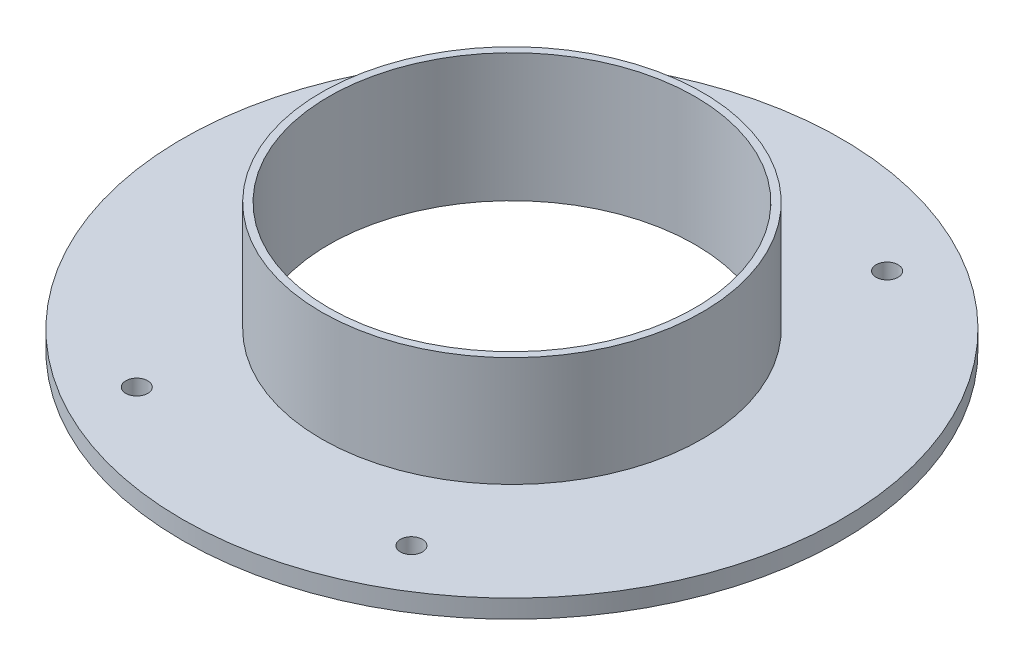
ISO-10303-21;
HEADER;
FILE_DESCRIPTION(('STEP AP214'),'2;1');
FILE_NAME('part.step','',(''),(''),'','','');
FILE_SCHEMA(('AUTOMOTIVE_DESIGN { 1 0 10303 214 1 1 1 1 }'));
ENDSEC;
DATA;
#1=APPLICATION_CONTEXT('core data for automotive mechanical design processes');
#2=APPLICATION_PROTOCOL_DEFINITION('international standard','automotive_design',2000,#1);
#3=PRODUCT_CONTEXT('',#1,'mechanical');
#4=PRODUCT('Part','Part','',(#3));
#5=PRODUCT_RELATED_PRODUCT_CATEGORY('part','',(#4));
#6=PRODUCT_DEFINITION_FORMATION('','',#4);
#7=PRODUCT_DEFINITION_CONTEXT('part definition',#1,'design');
#8=PRODUCT_DEFINITION('design','',#6,#7);
#9=PRODUCT_DEFINITION_SHAPE('','',#8);
#10=(LENGTH_UNIT() NAMED_UNIT(*) SI_UNIT(.MILLI.,.METRE.));
#11=(NAMED_UNIT(*) PLANE_ANGLE_UNIT() SI_UNIT($,.RADIAN.));
#12=(NAMED_UNIT(*) SI_UNIT($,.STERADIAN.) SOLID_ANGLE_UNIT());
#13=UNCERTAINTY_MEASURE_WITH_UNIT(LENGTH_MEASURE(1.E-05),#10,'distance_accuracy_value','');
#14=(GEOMETRIC_REPRESENTATION_CONTEXT(3) GLOBAL_UNCERTAINTY_ASSIGNED_CONTEXT((#13)) GLOBAL_UNIT_ASSIGNED_CONTEXT((#10,
#11,#12)) REPRESENTATION_CONTEXT('',''));
#15=CARTESIAN_POINT('',(0.,0.,0.));
#16=DIRECTION('',(0.,0.,1.));
#17=DIRECTION('',(1.,0.,0.));
#18=AXIS2_PLACEMENT_3D('',#15,#16,#17);
#19=CARTESIAN_POINT('',(0.,5.,0.));
#20=DIRECTION('',(0.,1.,0.));
#21=DIRECTION('',(0.,0.,1.));
#22=AXIS2_PLACEMENT_3D('',#19,#20,#21);
#23=PLANE('',#22);
#24=CARTESIAN_POINT('',(-37.5000000000003,5.,64.9519052838327));
#25=DIRECTION('',(0.,1.,0.));
#26=DIRECTION('',(0.,0.,1.));
#27=AXIS2_PLACEMENT_3D('',#24,#25,#26);
#28=CIRCLE('',#27,2.99999999999999);
#29=CARTESIAN_POINT('',(-37.5000000000003,5.,67.9519052838327));
#30=VERTEX_POINT('',#29);
#31=EDGE_CURVE('E76',#30,#30,#28,.T.);
#32=ORIENTED_EDGE('',*,*,#31,.F.);
#33=EDGE_LOOP('',(#32));
#34=FACE_BOUND('',#33,.T.);
#35=CARTESIAN_POINT('',(-37.5000000000003,5.,-64.9519052838327));
#36=DIRECTION('',(0.,1.,0.));
#37=DIRECTION('',(0.,0.,-1.));
#38=AXIS2_PLACEMENT_3D('',#35,#36,#37);
#39=CIRCLE('',#38,2.99999999999999);
#40=CARTESIAN_POINT('',(-37.5000000000003,5.,-67.9519052838327));
#41=VERTEX_POINT('',#40);
#42=EDGE_CURVE('E60',#41,#41,#39,.T.);
#43=ORIENTED_EDGE('',*,*,#42,.F.);
#44=EDGE_LOOP('',(#43));
#45=FACE_BOUND('',#44,.T.);
#46=CARTESIAN_POINT('',(0.,5.,0.));
#47=DIRECTION('',(0.,1.,0.));
#48=DIRECTION('',(0.,0.,1.));
#49=AXIS2_PLACEMENT_3D('',#46,#47,#48);
#50=CIRCLE('',#49,90.);
#51=CARTESIAN_POINT('',(0.,5.,90.));
#52=VERTEX_POINT('',#51);
#53=EDGE_CURVE('E10',#52,#52,#50,.T.);
#54=ORIENTED_EDGE('',*,*,#53,.T.);
#55=EDGE_LOOP('',(#54));
#56=FACE_BOUND('',#55,.T.);
#57=CARTESIAN_POINT('',(37.5000000000003,5.,-64.9519052838327));
#58=DIRECTION('',(0.,1.,0.));
#59=DIRECTION('',(0.,0.,1.));
#60=AXIS2_PLACEMENT_3D('',#57,#58,#59);
#61=CIRCLE('',#60,2.99999999999999);
#62=CARTESIAN_POINT('',(37.5000000000003,5.,-61.9519052838327));
#63=VERTEX_POINT('',#62);
#64=EDGE_CURVE('E55',#63,#63,#61,.T.);
#65=ORIENTED_EDGE('',*,*,#64,.F.);
#66=EDGE_LOOP('',(#65));
#67=FACE_BOUND('',#66,.T.);
#68=CARTESIAN_POINT('',(37.5000000000003,5.,64.9519052838327));
#69=DIRECTION('',(0.,1.,0.));
#70=DIRECTION('',(0.,0.,-1.));
#71=AXIS2_PLACEMENT_3D('',#68,#69,#70);
#72=CIRCLE('',#71,2.99999999999999);
#73=CARTESIAN_POINT('',(37.5000000000003,5.,61.9519052838327));
#74=VERTEX_POINT('',#73);
#75=EDGE_CURVE('E68',#74,#74,#72,.T.);
#76=ORIENTED_EDGE('',*,*,#75,.F.);
#77=EDGE_LOOP('',(#76));
#78=FACE_BOUND('',#77,.T.);
#79=CARTESIAN_POINT('',(0.,5.,0.));
#80=DIRECTION('',(0.,1.,0.));
#81=DIRECTION('',(0.,0.,1.));
#82=AXIS2_PLACEMENT_3D('',#79,#80,#81);
#83=CIRCLE('',#82,52.);
#84=CARTESIAN_POINT('',(0.,5.,52.));
#85=VERTEX_POINT('',#84);
#86=EDGE_CURVE('E88',#85,#85,#83,.T.);
#87=ORIENTED_EDGE('',*,*,#86,.F.);
#88=EDGE_LOOP('',(#87));
#89=FACE_BOUND('',#88,.T.);
#90=ADVANCED_FACE('F37',(#34,#45,#56,#67,#78,#89),#23,.T.);
#91=CARTESIAN_POINT('',(0.,0.,0.));
#92=DIRECTION('',(0.,1.,0.));
#93=DIRECTION('',(0.,0.,1.));
#94=AXIS2_PLACEMENT_3D('',#91,#92,#93);
#95=PLANE('',#94);
#96=CARTESIAN_POINT('',(0.,0.,0.));
#97=DIRECTION('',(0.,1.,0.));
#98=DIRECTION('',(0.,0.,1.));
#99=AXIS2_PLACEMENT_3D('',#96,#97,#98);
#100=CIRCLE('',#99,90.);
#101=CARTESIAN_POINT('',(0.,0.,90.));
#102=VERTEX_POINT('',#101);
#103=EDGE_CURVE('E41',#102,#102,#100,.T.);
#104=ORIENTED_EDGE('',*,*,#103,.F.);
#105=EDGE_LOOP('',(#104));
#106=FACE_BOUND('',#105,.T.);
#107=CARTESIAN_POINT('',(0.,0.,0.));
#108=DIRECTION('',(0.,1.,0.));
#109=DIRECTION('',(0.,0.,1.));
#110=AXIS2_PLACEMENT_3D('',#107,#108,#109);
#111=CIRCLE('',#110,50.);
#112=CARTESIAN_POINT('',(0.,0.,50.));
#113=VERTEX_POINT('',#112);
#114=EDGE_CURVE('E50',#113,#113,#111,.T.);
#115=ORIENTED_EDGE('',*,*,#114,.T.);
#116=EDGE_LOOP('',(#115));
#117=FACE_BOUND('',#116,.T.);
#118=CARTESIAN_POINT('',(37.5000000000003,0.,-64.9519052838327));
#119=DIRECTION('',(0.,1.,0.));
#120=DIRECTION('',(0.,0.,1.));
#121=AXIS2_PLACEMENT_3D('',#118,#119,#120);
#122=CIRCLE('',#121,2.99999999999999);
#123=CARTESIAN_POINT('',(37.5000000000003,0.,-61.9519052838327));
#124=VERTEX_POINT('',#123);
#125=EDGE_CURVE('E56',#124,#124,#122,.T.);
#126=ORIENTED_EDGE('',*,*,#125,.T.);
#127=EDGE_LOOP('',(#126));
#128=FACE_BOUND('',#127,.T.);
#129=CARTESIAN_POINT('',(-37.5000000000003,0.,-64.9519052838327));
#130=DIRECTION('',(0.,1.,0.));
#131=DIRECTION('',(0.,0.,-1.));
#132=AXIS2_PLACEMENT_3D('',#129,#130,#131);
#133=CIRCLE('',#132,2.99999999999999);
#134=CARTESIAN_POINT('',(-37.5000000000003,0.,-67.9519052838327));
#135=VERTEX_POINT('',#134);
#136=EDGE_CURVE('E64',#135,#135,#133,.T.);
#137=ORIENTED_EDGE('',*,*,#136,.T.);
#138=EDGE_LOOP('',(#137));
#139=FACE_BOUND('',#138,.T.);
#140=CARTESIAN_POINT('',(37.5000000000003,0.,64.9519052838327));
#141=DIRECTION('',(0.,1.,0.));
#142=DIRECTION('',(0.,0.,-1.));
#143=AXIS2_PLACEMENT_3D('',#140,#141,#142);
#144=CIRCLE('',#143,2.99999999999999);
#145=CARTESIAN_POINT('',(37.5000000000003,0.,61.9519052838327));
#146=VERTEX_POINT('',#145);
#147=EDGE_CURVE('E72',#146,#146,#144,.T.);
#148=ORIENTED_EDGE('',*,*,#147,.T.);
#149=EDGE_LOOP('',(#148));
#150=FACE_BOUND('',#149,.T.);
#151=CARTESIAN_POINT('',(-37.5000000000003,0.,64.9519052838327));
#152=DIRECTION('',(0.,1.,0.));
#153=DIRECTION('',(0.,0.,1.));
#154=AXIS2_PLACEMENT_3D('',#151,#152,#153);
#155=CIRCLE('',#154,2.99999999999999);
#156=CARTESIAN_POINT('',(-37.5000000000003,0.,67.9519052838327));
#157=VERTEX_POINT('',#156);
#158=EDGE_CURVE('E80',#157,#157,#155,.T.);
#159=ORIENTED_EDGE('',*,*,#158,.T.);
#160=EDGE_LOOP('',(#159));
#161=FACE_BOUND('',#160,.T.);
#162=ADVANCED_FACE('F118',(#106,#117,#128,#139,#150,#161),#95,.F.);
#163=CARTESIAN_POINT('',(0.,5.,0.));
#164=DIRECTION('',(0.,-1.,0.));
#165=DIRECTION('',(0.,0.,-1.));
#166=AXIS2_PLACEMENT_3D('',#163,#164,#165);
#167=CYLINDRICAL_SURFACE('',#166,90.);
#168=ORIENTED_EDGE('',*,*,#53,.F.);
#169=EDGE_LOOP('',(#168));
#170=FACE_BOUND('',#169,.T.);
#171=ORIENTED_EDGE('',*,*,#103,.T.);
#172=EDGE_LOOP('',(#171));
#173=FACE_BOUND('',#172,.T.);
#174=ADVANCED_FACE('F39',(#170,#173),#167,.T.);
#175=CARTESIAN_POINT('',(0.,5.,0.));
#176=DIRECTION('',(0.,-1.,0.));
#177=DIRECTION('',(0.,0.,-1.));
#178=AXIS2_PLACEMENT_3D('',#175,#176,#177);
#179=CYLINDRICAL_SURFACE('',#178,50.);
#180=ORIENTED_EDGE('',*,*,#114,.F.);
#181=EDGE_LOOP('',(#180));
#182=FACE_BOUND('',#181,.T.);
#183=CARTESIAN_POINT('',(0.,35.,0.));
#184=DIRECTION('',(0.,1.,0.));
#185=DIRECTION('',(0.,0.,1.));
#186=AXIS2_PLACEMENT_3D('',#183,#184,#185);
#187=CIRCLE('',#186,50.);
#188=CARTESIAN_POINT('',(0.,35.,50.));
#189=VERTEX_POINT('',#188);
#190=EDGE_CURVE('E92',#189,#189,#187,.T.);
#191=ORIENTED_EDGE('',*,*,#190,.T.);
#192=EDGE_LOOP('',(#191));
#193=FACE_BOUND('',#192,.T.);
#194=ADVANCED_FACE('F100',(#182,#193),#179,.F.);
#195=CARTESIAN_POINT('',(37.5000000000003,5.,-64.9519052838327));
#196=DIRECTION('',(0.,-1.,0.));
#197=DIRECTION('',(0.,0.,-1.));
#198=AXIS2_PLACEMENT_3D('',#195,#196,#197);
#199=CYLINDRICAL_SURFACE('',#198,2.99999999999999);
#200=ORIENTED_EDGE('',*,*,#64,.T.);
#201=EDGE_LOOP('',(#200));
#202=FACE_BOUND('',#201,.T.);
#203=ORIENTED_EDGE('',*,*,#125,.F.);
#204=EDGE_LOOP('',(#203));
#205=FACE_BOUND('',#204,.T.);
#206=ADVANCED_FACE('F130',(#202,#205),#199,.F.);
#207=CARTESIAN_POINT('',(-37.5000000000003,5.,-64.9519052838327));
#208=DIRECTION('',(0.,-1.,0.));
#209=DIRECTION('',(0.,0.,-1.));
#210=AXIS2_PLACEMENT_3D('',#207,#208,#209);
#211=CYLINDRICAL_SURFACE('',#210,2.99999999999999);
#212=ORIENTED_EDGE('',*,*,#42,.T.);
#213=EDGE_LOOP('',(#212));
#214=FACE_BOUND('',#213,.T.);
#215=ORIENTED_EDGE('',*,*,#136,.F.);
#216=EDGE_LOOP('',(#215));
#217=FACE_BOUND('',#216,.T.);
#218=ADVANCED_FACE('F134',(#214,#217),#211,.F.);
#219=CARTESIAN_POINT('',(37.5000000000003,5.,64.9519052838327));
#220=DIRECTION('',(0.,-1.,0.));
#221=DIRECTION('',(0.,0.,-1.));
#222=AXIS2_PLACEMENT_3D('',#219,#220,#221);
#223=CYLINDRICAL_SURFACE('',#222,2.99999999999999);
#224=ORIENTED_EDGE('',*,*,#75,.T.);
#225=EDGE_LOOP('',(#224));
#226=FACE_BOUND('',#225,.T.);
#227=ORIENTED_EDGE('',*,*,#147,.F.);
#228=EDGE_LOOP('',(#227));
#229=FACE_BOUND('',#228,.T.);
#230=ADVANCED_FACE('F114',(#226,#229),#223,.F.);
#231=CARTESIAN_POINT('',(-37.5000000000003,5.,64.9519052838327));
#232=DIRECTION('',(0.,-1.,0.));
#233=DIRECTION('',(0.,0.,-1.));
#234=AXIS2_PLACEMENT_3D('',#231,#232,#233);
#235=CYLINDRICAL_SURFACE('',#234,2.99999999999999);
#236=ORIENTED_EDGE('',*,*,#31,.T.);
#237=EDGE_LOOP('',(#236));
#238=FACE_BOUND('',#237,.T.);
#239=ORIENTED_EDGE('',*,*,#158,.F.);
#240=EDGE_LOOP('',(#239));
#241=FACE_BOUND('',#240,.T.);
#242=ADVANCED_FACE('F105',(#238,#241),#235,.F.);
#243=CARTESIAN_POINT('',(0.,35.,0.));
#244=DIRECTION('',(0.,1.,0.));
#245=DIRECTION('',(0.,0.,1.));
#246=AXIS2_PLACEMENT_3D('',#243,#244,#245);
#247=PLANE('',#246);
#248=CARTESIAN_POINT('',(0.,35.,0.));
#249=DIRECTION('',(0.,1.,0.));
#250=DIRECTION('',(0.,0.,1.));
#251=AXIS2_PLACEMENT_3D('',#248,#249,#250);
#252=CIRCLE('',#251,52.);
#253=CARTESIAN_POINT('',(0.,35.,52.));
#254=VERTEX_POINT('',#253);
#255=EDGE_CURVE('E84',#254,#254,#252,.T.);
#256=ORIENTED_EDGE('',*,*,#255,.T.);
#257=EDGE_LOOP('',(#256));
#258=FACE_BOUND('',#257,.T.);
#259=ORIENTED_EDGE('',*,*,#190,.F.);
#260=EDGE_LOOP('',(#259));
#261=FACE_BOUND('',#260,.T.);
#262=ADVANCED_FACE('F102',(#258,#261),#247,.T.);
#263=CARTESIAN_POINT('',(0.,35.,0.));
#264=DIRECTION('',(0.,-1.,0.));
#265=DIRECTION('',(0.,0.,-1.));
#266=AXIS2_PLACEMENT_3D('',#263,#264,#265);
#267=CYLINDRICAL_SURFACE('',#266,52.);
#268=ORIENTED_EDGE('',*,*,#255,.F.);
#269=EDGE_LOOP('',(#268));
#270=FACE_BOUND('',#269,.T.);
#271=ORIENTED_EDGE('',*,*,#86,.T.);
#272=EDGE_LOOP('',(#271));
#273=FACE_BOUND('',#272,.T.);
#274=ADVANCED_FACE('F104',(#270,#273),#267,.T.);
#275=CLOSED_SHELL('',(#90,#162,#174,#194,#206,#218,#230,#242,#262,#274));
#276=MANIFOLD_SOLID_BREP('B2',#275);
#277=ADVANCED_BREP_SHAPE_REPRESENTATION('',(#18,#276),#14);
#278=SHAPE_DEFINITION_REPRESENTATION(#9,#277);
ENDSEC;
END-ISO-10303-21;
